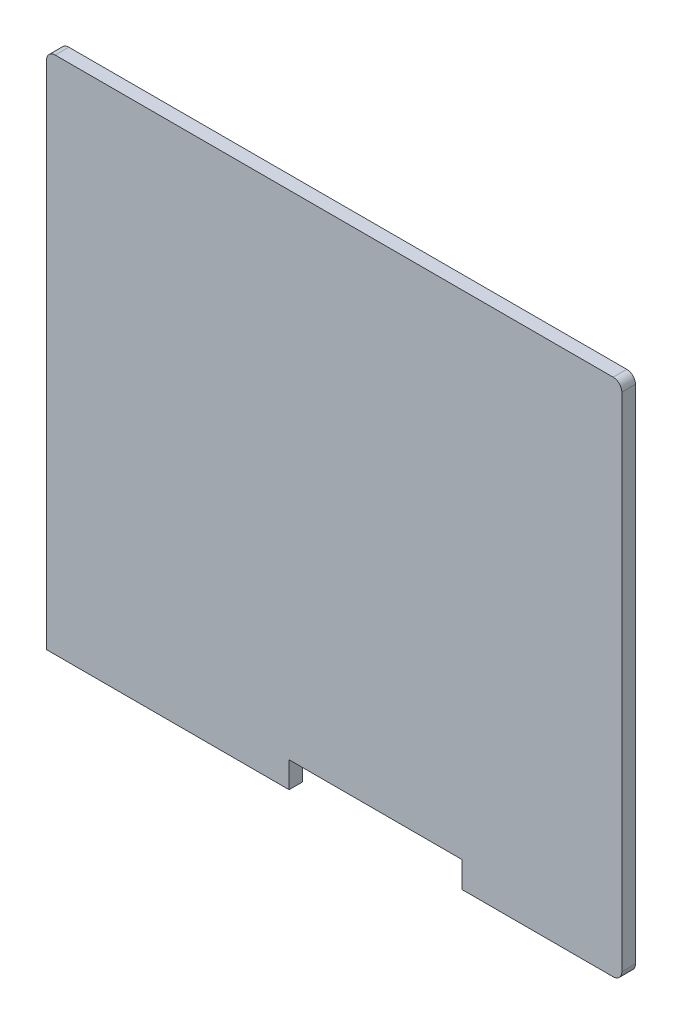
ISO-10303-21;
HEADER;
FILE_DESCRIPTION(('STEP AP214'),'2;1');
FILE_NAME('part.step','',(''),(''),'','','');
FILE_SCHEMA(('AUTOMOTIVE_DESIGN { 1 0 10303 214 1 1 1 1 }'));
ENDSEC;
DATA;
#1=APPLICATION_CONTEXT('core data for automotive mechanical design processes');
#2=APPLICATION_PROTOCOL_DEFINITION('international standard','automotive_design',2000,#1);
#3=PRODUCT_CONTEXT('',#1,'mechanical');
#4=PRODUCT('Part','Part','',(#3));
#5=PRODUCT_RELATED_PRODUCT_CATEGORY('part','',(#4));
#6=PRODUCT_DEFINITION_FORMATION('','',#4);
#7=PRODUCT_DEFINITION_CONTEXT('part definition',#1,'design');
#8=PRODUCT_DEFINITION('design','',#6,#7);
#9=PRODUCT_DEFINITION_SHAPE('','',#8);
#10=(LENGTH_UNIT() NAMED_UNIT(*) SI_UNIT(.MILLI.,.METRE.));
#11=(NAMED_UNIT(*) PLANE_ANGLE_UNIT() SI_UNIT($,.RADIAN.));
#12=(NAMED_UNIT(*) SI_UNIT($,.STERADIAN.) SOLID_ANGLE_UNIT());
#13=UNCERTAINTY_MEASURE_WITH_UNIT(LENGTH_MEASURE(1.E-05),#10,'distance_accuracy_value','');
#14=(GEOMETRIC_REPRESENTATION_CONTEXT(3) GLOBAL_UNCERTAINTY_ASSIGNED_CONTEXT((#13)) GLOBAL_UNIT_ASSIGNED_CONTEXT((#10,
#11,#12)) REPRESENTATION_CONTEXT('',''));
#15=CARTESIAN_POINT('',(0.,0.,0.));
#16=DIRECTION('',(0.,0.,1.));
#17=DIRECTION('',(1.,0.,0.));
#18=AXIS2_PLACEMENT_3D('',#15,#16,#17);
#19=CARTESIAN_POINT('',(55.5709843246072,7.31756397931187,-1.5748));
#20=DIRECTION('',(0.,-1.,0.));
#21=DIRECTION('',(0.,0.,-1.));
#22=AXIS2_PLACEMENT_3D('',#19,#20,#21);
#23=PLANE('',#22);
#24=DIRECTION('',(1.,0.,0.));
#25=VECTOR('',#24,1.);
#26=CARTESIAN_POINT('',(55.5709843246072,7.31756397931187,0.));
#27=LINE('',#26,#25);
#28=CARTESIAN_POINT('',(55.5709843246072,7.31756397931187,0.));
#29=VERTEX_POINT('',#28);
#30=CARTESIAN_POINT('',(83.5969843246072,7.31756397931187,0.));
#31=VERTEX_POINT('',#30);
#32=EDGE_CURVE('E148',#29,#31,#27,.T.);
#33=ORIENTED_EDGE('',*,*,#32,.F.);
#34=DIRECTION('',(0.,0.,1.));
#35=VECTOR('',#34,1.);
#36=CARTESIAN_POINT('',(55.5709843246072,7.31756397931187,-1.5748));
#37=LINE('',#36,#35);
#38=CARTESIAN_POINT('',(55.5709843246072,7.31756397931187,-1.5748));
#39=VERTEX_POINT('',#38);
#40=EDGE_CURVE('E11',#39,#29,#37,.T.);
#41=ORIENTED_EDGE('',*,*,#40,.F.);
#42=DIRECTION('',(1.,0.,0.));
#43=VECTOR('',#42,1.);
#44=CARTESIAN_POINT('',(55.5709843246072,7.31756397931187,-1.5748));
#45=LINE('',#44,#43);
#46=CARTESIAN_POINT('',(83.5969843246072,7.31756397931187,-1.5748));
#47=VERTEX_POINT('',#46);
#48=EDGE_CURVE('E177',#39,#47,#45,.T.);
#49=ORIENTED_EDGE('',*,*,#48,.T.);
#50=DIRECTION('',(0.,0.,1.));
#51=VECTOR('',#50,1.);
#52=CARTESIAN_POINT('',(83.5969843246072,7.31756397931187,-1.5748));
#53=LINE('',#52,#51);
#54=EDGE_CURVE('E36',#47,#31,#53,.T.);
#55=ORIENTED_EDGE('',*,*,#54,.T.);
#56=EDGE_LOOP('',(#33,#41,#49,#55));
#57=FACE_BOUND('',#56,.T.);
#58=ADVANCED_FACE('F33',(#57),#23,.T.);
#59=CARTESIAN_POINT('',(55.5709843246072,66.3175639793119,-1.5748));
#60=DIRECTION('',(-1.,0.,0.));
#61=DIRECTION('',(0.,-1.,0.));
#62=AXIS2_PLACEMENT_3D('',#59,#60,#61);
#63=PLANE('',#62);
#64=DIRECTION('',(0.,-1.,0.));
#65=VECTOR('',#64,1.);
#66=CARTESIAN_POINT('',(55.5709843246072,66.3175639793119,0.));
#67=LINE('',#66,#65);
#68=CARTESIAN_POINT('',(55.5709843246072,66.3175639793119,0.));
#69=VERTEX_POINT('',#68);
#70=EDGE_CURVE('E175',#69,#29,#67,.T.);
#71=ORIENTED_EDGE('',*,*,#70,.F.);
#72=DIRECTION('',(0.,0.,1.));
#73=VECTOR('',#72,1.);
#74=CARTESIAN_POINT('',(55.5709843246072,66.3175639793119,-1.5748));
#75=LINE('',#74,#73);
#76=CARTESIAN_POINT('',(55.5709843246072,66.3175639793119,-1.5748));
#77=VERTEX_POINT('',#76);
#78=EDGE_CURVE('E42',#77,#69,#75,.T.);
#79=ORIENTED_EDGE('',*,*,#78,.F.);
#80=DIRECTION('',(0.,-1.,0.));
#81=VECTOR('',#80,1.);
#82=CARTESIAN_POINT('',(55.5709843246072,66.3175639793119,-1.5748));
#83=LINE('',#82,#81);
#84=EDGE_CURVE('E138',#77,#39,#83,.T.);
#85=ORIENTED_EDGE('',*,*,#84,.T.);
#86=ORIENTED_EDGE('',*,*,#40,.T.);
#87=EDGE_LOOP('',(#71,#79,#85,#86));
#88=FACE_BOUND('',#87,.T.);
#89=ADVANCED_FACE('F195',(#88),#63,.T.);
#90=CARTESIAN_POINT('',(56.5709843246072,66.3175639793119,-1.5748));
#91=DIRECTION('',(0.,0.,1.));
#92=DIRECTION('',(1.,0.,0.));
#93=AXIS2_PLACEMENT_3D('',#90,#91,#92);
#94=CYLINDRICAL_SURFACE('',#93,1.);
#95=CARTESIAN_POINT('',(56.5709843246072,66.3175639793119,0.));
#96=DIRECTION('',(0.,0.,1.));
#97=DIRECTION('',(1.,0.,0.));
#98=AXIS2_PLACEMENT_3D('',#95,#96,#97);
#99=CIRCLE('',#98,1.);
#100=CARTESIAN_POINT('',(56.5709843246072,67.3175639793119,0.));
#101=VERTEX_POINT('',#100);
#102=EDGE_CURVE('E125',#101,#69,#99,.T.);
#103=ORIENTED_EDGE('',*,*,#102,.F.);
#104=DIRECTION('',(0.,0.,1.));
#105=VECTOR('',#104,1.);
#106=CARTESIAN_POINT('',(56.5709843246072,67.3175639793119,-1.5748));
#107=LINE('',#106,#105);
#108=CARTESIAN_POINT('',(56.5709843246072,67.3175639793119,-1.5748));
#109=VERTEX_POINT('',#108);
#110=EDGE_CURVE('E120',#109,#101,#107,.T.);
#111=ORIENTED_EDGE('',*,*,#110,.F.);
#112=CARTESIAN_POINT('',(56.5709843246072,66.3175639793119,-1.5748));
#113=DIRECTION('',(0.,0.,1.));
#114=DIRECTION('',(1.,0.,0.));
#115=AXIS2_PLACEMENT_3D('',#112,#113,#114);
#116=CIRCLE('',#115,1.);
#117=EDGE_CURVE('E123',#109,#77,#116,.T.);
#118=ORIENTED_EDGE('',*,*,#117,.T.);
#119=ORIENTED_EDGE('',*,*,#78,.T.);
#120=EDGE_LOOP('',(#103,#111,#118,#119));
#121=FACE_BOUND('',#120,.T.);
#122=ADVANCED_FACE('F122',(#121),#94,.T.);
#123=CARTESIAN_POINT('',(56.5709843246072,67.3175639793119,-1.5748));
#124=DIRECTION('',(0.,1.,0.));
#125=DIRECTION('',(-1.,0.,0.));
#126=AXIS2_PLACEMENT_3D('',#123,#124,#125);
#127=PLANE('',#126);
#128=DIRECTION('',(-1.,0.,0.));
#129=VECTOR('',#128,1.);
#130=CARTESIAN_POINT('',(56.5709843246072,67.3175639793119,0.));
#131=LINE('',#130,#129);
#132=CARTESIAN_POINT('',(121.040984324607,67.3175639793119,0.));
#133=VERTEX_POINT('',#132);
#134=EDGE_CURVE('E172',#133,#101,#131,.T.);
#135=ORIENTED_EDGE('',*,*,#134,.F.);
#136=DIRECTION('',(0.,0.,1.));
#137=VECTOR('',#136,1.);
#138=CARTESIAN_POINT('',(121.040984324607,67.3175639793119,-1.5748));
#139=LINE('',#138,#137);
#140=CARTESIAN_POINT('',(121.040984324607,67.3175639793119,-1.5748));
#141=VERTEX_POINT('',#140);
#142=EDGE_CURVE('E130',#141,#133,#139,.T.);
#143=ORIENTED_EDGE('',*,*,#142,.F.);
#144=DIRECTION('',(-1.,0.,0.));
#145=VECTOR('',#144,1.);
#146=CARTESIAN_POINT('',(56.5709843246072,67.3175639793119,-1.5748));
#147=LINE('',#146,#145);
#148=EDGE_CURVE('E136',#141,#109,#147,.T.);
#149=ORIENTED_EDGE('',*,*,#148,.T.);
#150=ORIENTED_EDGE('',*,*,#110,.T.);
#151=EDGE_LOOP('',(#135,#143,#149,#150));
#152=FACE_BOUND('',#151,.T.);
#153=ADVANCED_FACE('F140',(#152),#127,.T.);
#154=CARTESIAN_POINT('',(121.040984324607,66.3175639793119,-1.5748));
#155=DIRECTION('',(0.,0.,1.));
#156=DIRECTION('',(1.,0.,0.));
#157=AXIS2_PLACEMENT_3D('',#154,#155,#156);
#158=CYLINDRICAL_SURFACE('',#157,1.);
#159=CARTESIAN_POINT('',(121.040984324607,66.3175639793119,0.));
#160=DIRECTION('',(0.,0.,1.));
#161=DIRECTION('',(-1.,0.,0.));
#162=AXIS2_PLACEMENT_3D('',#159,#160,#161);
#163=CIRCLE('',#162,1.);
#164=CARTESIAN_POINT('',(122.040984324607,66.3175639793119,0.));
#165=VERTEX_POINT('',#164);
#166=EDGE_CURVE('E169',#165,#133,#163,.T.);
#167=ORIENTED_EDGE('',*,*,#166,.F.);
#168=DIRECTION('',(0.,0.,1.));
#169=VECTOR('',#168,1.);
#170=CARTESIAN_POINT('',(122.040984324607,66.3175639793119,-1.5748));
#171=LINE('',#170,#169);
#172=CARTESIAN_POINT('',(122.040984324607,66.3175639793119,-1.5748));
#173=VERTEX_POINT('',#172);
#174=EDGE_CURVE('E181',#173,#165,#171,.T.);
#175=ORIENTED_EDGE('',*,*,#174,.F.);
#176=CARTESIAN_POINT('',(121.040984324607,66.3175639793119,-1.5748));
#177=DIRECTION('',(0.,0.,1.));
#178=DIRECTION('',(-1.,0.,0.));
#179=AXIS2_PLACEMENT_3D('',#176,#177,#178);
#180=CIRCLE('',#179,1.);
#181=EDGE_CURVE('E141',#173,#141,#180,.T.);
#182=ORIENTED_EDGE('',*,*,#181,.T.);
#183=ORIENTED_EDGE('',*,*,#142,.T.);
#184=EDGE_LOOP('',(#167,#175,#182,#183));
#185=FACE_BOUND('',#184,.T.);
#186=ADVANCED_FACE('F208',(#185),#158,.T.);
#187=CARTESIAN_POINT('',(122.040984324607,66.3175639793119,-1.5748));
#188=DIRECTION('',(1.,0.,0.));
#189=DIRECTION('',(0.,1.,0.));
#190=AXIS2_PLACEMENT_3D('',#187,#188,#189);
#191=PLANE('',#190);
#192=DIRECTION('',(0.,1.,0.));
#193=VECTOR('',#192,1.);
#194=CARTESIAN_POINT('',(122.040984324607,66.3175639793119,0.));
#195=LINE('',#194,#193);
#196=CARTESIAN_POINT('',(122.040984324607,8.31756397931187,0.));
#197=VERTEX_POINT('',#196);
#198=EDGE_CURVE('E166',#197,#165,#195,.T.);
#199=ORIENTED_EDGE('',*,*,#198,.F.);
#200=DIRECTION('',(0.,0.,1.));
#201=VECTOR('',#200,1.);
#202=CARTESIAN_POINT('',(122.040984324607,8.31756397931187,-1.5748));
#203=LINE('',#202,#201);
#204=CARTESIAN_POINT('',(122.040984324607,8.31756397931187,-1.5748));
#205=VERTEX_POINT('',#204);
#206=EDGE_CURVE('E183',#205,#197,#203,.T.);
#207=ORIENTED_EDGE('',*,*,#206,.F.);
#208=DIRECTION('',(0.,1.,0.));
#209=VECTOR('',#208,1.);
#210=CARTESIAN_POINT('',(122.040984324607,66.3175639793119,-1.5748));
#211=LINE('',#210,#209);
#212=EDGE_CURVE('E143',#205,#173,#211,.T.);
#213=ORIENTED_EDGE('',*,*,#212,.T.);
#214=ORIENTED_EDGE('',*,*,#174,.T.);
#215=EDGE_LOOP('',(#199,#207,#213,#214));
#216=FACE_BOUND('',#215,.T.);
#217=ADVANCED_FACE('F211',(#216),#191,.T.);
#218=CARTESIAN_POINT('',(121.040984324607,8.31756397931187,-1.5748));
#219=DIRECTION('',(0.,0.,1.));
#220=DIRECTION('',(1.,0.,0.));
#221=AXIS2_PLACEMENT_3D('',#218,#219,#220);
#222=CYLINDRICAL_SURFACE('',#221,1.00000000000001);
#223=CARTESIAN_POINT('',(121.040984324607,8.31756397931187,0.));
#224=DIRECTION('',(0.,0.,1.));
#225=DIRECTION('',(1.,0.,0.));
#226=AXIS2_PLACEMENT_3D('',#223,#224,#225);
#227=CIRCLE('',#226,1.00000000000001);
#228=CARTESIAN_POINT('',(121.040984324607,7.31756397931187,0.));
#229=VERTEX_POINT('',#228);
#230=EDGE_CURVE('E163',#229,#197,#227,.T.);
#231=ORIENTED_EDGE('',*,*,#230,.F.);
#232=DIRECTION('',(0.,0.,1.));
#233=VECTOR('',#232,1.);
#234=CARTESIAN_POINT('',(121.040984324607,7.31756397931187,-1.5748));
#235=LINE('',#234,#233);
#236=CARTESIAN_POINT('',(121.040984324607,7.31756397931187,-1.5748));
#237=VERTEX_POINT('',#236);
#238=EDGE_CURVE('E185',#237,#229,#235,.T.);
#239=ORIENTED_EDGE('',*,*,#238,.F.);
#240=CARTESIAN_POINT('',(121.040984324607,8.31756397931187,-1.5748));
#241=DIRECTION('',(0.,0.,1.));
#242=DIRECTION('',(1.,0.,0.));
#243=AXIS2_PLACEMENT_3D('',#240,#241,#242);
#244=CIRCLE('',#243,1.00000000000001);
#245=EDGE_CURVE('E327',#237,#205,#244,.T.);
#246=ORIENTED_EDGE('',*,*,#245,.T.);
#247=ORIENTED_EDGE('',*,*,#206,.T.);
#248=EDGE_LOOP('',(#231,#239,#246,#247));
#249=FACE_BOUND('',#248,.T.);
#250=ADVANCED_FACE('F215',(#249),#222,.T.);
#251=CARTESIAN_POINT('',(103.596984324607,7.31756397931187,-1.5748));
#252=DIRECTION('',(0.,-1.,0.));
#253=DIRECTION('',(1.,0.,0.));
#254=AXIS2_PLACEMENT_3D('',#251,#252,#253);
#255=PLANE('',#254);
#256=DIRECTION('',(1.,0.,0.));
#257=VECTOR('',#256,1.);
#258=CARTESIAN_POINT('',(103.596984324607,7.31756397931187,0.));
#259=LINE('',#258,#257);
#260=CARTESIAN_POINT('',(103.596984324607,7.31756397931187,0.));
#261=VERTEX_POINT('',#260);
#262=EDGE_CURVE('E160',#261,#229,#259,.T.);
#263=ORIENTED_EDGE('',*,*,#262,.F.);
#264=DIRECTION('',(0.,0.,1.));
#265=VECTOR('',#264,1.);
#266=CARTESIAN_POINT('',(103.596984324607,7.31756397931187,-1.5748));
#267=LINE('',#266,#265);
#268=CARTESIAN_POINT('',(103.596984324607,7.31756397931187,-1.5748));
#269=VERTEX_POINT('',#268);
#270=EDGE_CURVE('E187',#269,#261,#267,.T.);
#271=ORIENTED_EDGE('',*,*,#270,.F.);
#272=DIRECTION('',(1.,0.,0.));
#273=VECTOR('',#272,1.);
#274=CARTESIAN_POINT('',(103.596984324607,7.31756397931187,-1.5748));
#275=LINE('',#274,#273);
#276=EDGE_CURVE('E320',#269,#237,#275,.T.);
#277=ORIENTED_EDGE('',*,*,#276,.T.);
#278=ORIENTED_EDGE('',*,*,#238,.T.);
#279=EDGE_LOOP('',(#263,#271,#277,#278));
#280=FACE_BOUND('',#279,.T.);
#281=ADVANCED_FACE('F219',(#280),#255,.T.);
#282=CARTESIAN_POINT('',(103.596984324607,10.3175639793119,-1.5748));
#283=DIRECTION('',(-1.,0.,0.));
#284=DIRECTION('',(0.,0.,1.));
#285=AXIS2_PLACEMENT_3D('',#282,#283,#284);
#286=PLANE('',#285);
#287=DIRECTION('',(0.,-1.,0.));
#288=VECTOR('',#287,1.);
#289=CARTESIAN_POINT('',(103.596984324607,10.3175639793119,0.));
#290=LINE('',#289,#288);
#291=CARTESIAN_POINT('',(103.596984324607,10.3175639793119,0.));
#292=VERTEX_POINT('',#291);
#293=EDGE_CURVE('E157',#292,#261,#290,.T.);
#294=ORIENTED_EDGE('',*,*,#293,.F.);
#295=DIRECTION('',(0.,0.,1.));
#296=VECTOR('',#295,1.);
#297=CARTESIAN_POINT('',(103.596984324607,10.3175639793119,-1.5748));
#298=LINE('',#297,#296);
#299=CARTESIAN_POINT('',(103.596984324607,10.3175639793119,-1.5748));
#300=VERTEX_POINT('',#299);
#301=EDGE_CURVE('E189',#300,#292,#298,.T.);
#302=ORIENTED_EDGE('',*,*,#301,.F.);
#303=DIRECTION('',(0.,-1.,0.));
#304=VECTOR('',#303,1.);
#305=CARTESIAN_POINT('',(103.596984324607,10.3175639793119,-1.5748));
#306=LINE('',#305,#304);
#307=EDGE_CURVE('E316',#300,#269,#306,.T.);
#308=ORIENTED_EDGE('',*,*,#307,.T.);
#309=ORIENTED_EDGE('',*,*,#270,.T.);
#310=EDGE_LOOP('',(#294,#302,#308,#309));
#311=FACE_BOUND('',#310,.T.);
#312=ADVANCED_FACE('F223',(#311),#286,.T.);
#313=CARTESIAN_POINT('',(83.5969843246072,10.3175639793119,-1.5748));
#314=DIRECTION('',(0.,-1.,0.));
#315=DIRECTION('',(0.,0.,-1.));
#316=AXIS2_PLACEMENT_3D('',#313,#314,#315);
#317=PLANE('',#316);
#318=DIRECTION('',(1.,0.,0.));
#319=VECTOR('',#318,1.);
#320=CARTESIAN_POINT('',(83.5969843246072,10.3175639793119,0.));
#321=LINE('',#320,#319);
#322=CARTESIAN_POINT('',(83.5969843246072,10.3175639793119,0.));
#323=VERTEX_POINT('',#322);
#324=EDGE_CURVE('E154',#323,#292,#321,.T.);
#325=ORIENTED_EDGE('',*,*,#324,.F.);
#326=DIRECTION('',(0.,0.,1.));
#327=VECTOR('',#326,1.);
#328=CARTESIAN_POINT('',(83.5969843246072,10.3175639793119,-1.5748));
#329=LINE('',#328,#327);
#330=CARTESIAN_POINT('',(83.5969843246072,10.3175639793119,-1.5748));
#331=VERTEX_POINT('',#330);
#332=EDGE_CURVE('E190',#331,#323,#329,.T.);
#333=ORIENTED_EDGE('',*,*,#332,.F.);
#334=DIRECTION('',(1.,0.,0.));
#335=VECTOR('',#334,1.);
#336=CARTESIAN_POINT('',(83.5969843246072,10.3175639793119,-1.5748));
#337=LINE('',#336,#335);
#338=EDGE_CURVE('E332',#331,#300,#337,.T.);
#339=ORIENTED_EDGE('',*,*,#338,.T.);
#340=ORIENTED_EDGE('',*,*,#301,.T.);
#341=EDGE_LOOP('',(#325,#333,#339,#340));
#342=FACE_BOUND('',#341,.T.);
#343=ADVANCED_FACE('F227',(#342),#317,.T.);
#344=CARTESIAN_POINT('',(83.5969843246072,7.31756397931187,-1.5748));
#345=DIRECTION('',(1.,0.,0.));
#346=DIRECTION('',(0.,0.,-1.));
#347=AXIS2_PLACEMENT_3D('',#344,#345,#346);
#348=PLANE('',#347);
#349=DIRECTION('',(0.,1.,0.));
#350=VECTOR('',#349,1.);
#351=CARTESIAN_POINT('',(83.5969843246072,7.31756397931187,0.));
#352=LINE('',#351,#350);
#353=EDGE_CURVE('E151',#31,#323,#352,.T.);
#354=ORIENTED_EDGE('',*,*,#353,.F.);
#355=ORIENTED_EDGE('',*,*,#54,.F.);
#356=DIRECTION('',(0.,1.,0.));
#357=VECTOR('',#356,1.);
#358=CARTESIAN_POINT('',(83.5969843246072,7.31756397931187,-1.5748));
#359=LINE('',#358,#357);
#360=EDGE_CURVE('E334',#47,#331,#359,.T.);
#361=ORIENTED_EDGE('',*,*,#360,.T.);
#362=ORIENTED_EDGE('',*,*,#332,.T.);
#363=EDGE_LOOP('',(#354,#355,#361,#362));
#364=FACE_BOUND('',#363,.T.);
#365=ADVANCED_FACE('F192',(#364),#348,.T.);
#366=CARTESIAN_POINT('',(121.040984324607,8.31756397931187,-1.5748));
#367=DIRECTION('',(0.,0.,1.));
#368=DIRECTION('',(1.,0.,0.));
#369=AXIS2_PLACEMENT_3D('',#366,#367,#368);
#370=PLANE('',#369);
#371=ORIENTED_EDGE('',*,*,#48,.F.);
#372=ORIENTED_EDGE('',*,*,#84,.F.);
#373=ORIENTED_EDGE('',*,*,#117,.F.);
#374=ORIENTED_EDGE('',*,*,#148,.F.);
#375=ORIENTED_EDGE('',*,*,#181,.F.);
#376=ORIENTED_EDGE('',*,*,#212,.F.);
#377=ORIENTED_EDGE('',*,*,#245,.F.);
#378=ORIENTED_EDGE('',*,*,#276,.F.);
#379=ORIENTED_EDGE('',*,*,#307,.F.);
#380=ORIENTED_EDGE('',*,*,#338,.F.);
#381=ORIENTED_EDGE('',*,*,#360,.F.);
#382=EDGE_LOOP('',(#371,#372,#373,#374,#375,#376,#377,#378,#379,#380,#381));
#383=FACE_BOUND('',#382,.T.);
#384=ADVANCED_FACE('F134',(#383),#370,.F.);
#385=CARTESIAN_POINT('',(121.040984324607,8.31756397931187,0.));
#386=DIRECTION('',(0.,0.,1.));
#387=DIRECTION('',(1.,0.,0.));
#388=AXIS2_PLACEMENT_3D('',#385,#386,#387);
#389=PLANE('',#388);
#390=ORIENTED_EDGE('',*,*,#32,.T.);
#391=ORIENTED_EDGE('',*,*,#353,.T.);
#392=ORIENTED_EDGE('',*,*,#324,.T.);
#393=ORIENTED_EDGE('',*,*,#293,.T.);
#394=ORIENTED_EDGE('',*,*,#262,.T.);
#395=ORIENTED_EDGE('',*,*,#230,.T.);
#396=ORIENTED_EDGE('',*,*,#198,.T.);
#397=ORIENTED_EDGE('',*,*,#166,.T.);
#398=ORIENTED_EDGE('',*,*,#134,.T.);
#399=ORIENTED_EDGE('',*,*,#102,.T.);
#400=ORIENTED_EDGE('',*,*,#70,.T.);
#401=EDGE_LOOP('',(#390,#391,#392,#393,#394,#395,#396,#397,#398,#399,#400));
#402=FACE_BOUND('',#401,.T.);
#403=ADVANCED_FACE('F194',(#402),#389,.T.);
#404=CLOSED_SHELL('',(#58,#89,#122,#153,#186,#217,#250,#281,#312,#343,#365,#384,#403));
#405=MANIFOLD_SOLID_BREP('B2',#404);
#406=ADVANCED_BREP_SHAPE_REPRESENTATION('',(#18,#405),#14);
#407=SHAPE_DEFINITION_REPRESENTATION(#9,#406);
ENDSEC;
END-ISO-10303-21;
